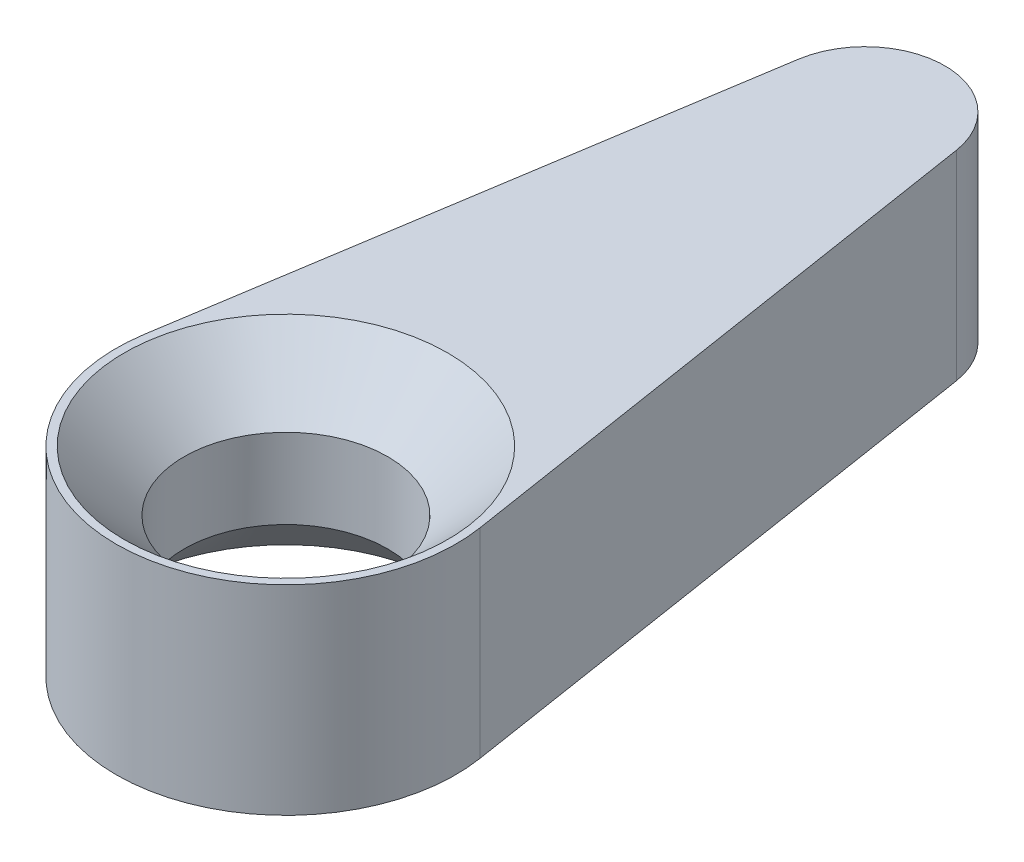
ISO-10303-21;
HEADER;
FILE_DESCRIPTION(('STEP AP214'),'2;1');
FILE_NAME('part.step','',(''),(''),'','','');
FILE_SCHEMA(('AUTOMOTIVE_DESIGN { 1 0 10303 214 1 1 1 1 }'));
ENDSEC;
DATA;
#1=APPLICATION_CONTEXT('core data for automotive mechanical design processes');
#2=APPLICATION_PROTOCOL_DEFINITION('international standard','automotive_design',2000,#1);
#3=PRODUCT_CONTEXT('',#1,'mechanical');
#4=PRODUCT('Part','Part','',(#3));
#5=PRODUCT_RELATED_PRODUCT_CATEGORY('part','',(#4));
#6=PRODUCT_DEFINITION_FORMATION('','',#4);
#7=PRODUCT_DEFINITION_CONTEXT('part definition',#1,'design');
#8=PRODUCT_DEFINITION('design','',#6,#7);
#9=PRODUCT_DEFINITION_SHAPE('','',#8);
#10=(LENGTH_UNIT() NAMED_UNIT(*) SI_UNIT(.MILLI.,.METRE.));
#11=(NAMED_UNIT(*) PLANE_ANGLE_UNIT() SI_UNIT($,.RADIAN.));
#12=(NAMED_UNIT(*) SI_UNIT($,.STERADIAN.) SOLID_ANGLE_UNIT());
#13=UNCERTAINTY_MEASURE_WITH_UNIT(LENGTH_MEASURE(1.E-05),#10,'distance_accuracy_value','');
#14=(GEOMETRIC_REPRESENTATION_CONTEXT(3) GLOBAL_UNCERTAINTY_ASSIGNED_CONTEXT((#13)) GLOBAL_UNIT_ASSIGNED_CONTEXT((#10,
#11,#12)) REPRESENTATION_CONTEXT('',''));
#15=CARTESIAN_POINT('',(0.,0.,0.));
#16=DIRECTION('',(0.,0.,1.));
#17=DIRECTION('',(1.,0.,0.));
#18=AXIS2_PLACEMENT_3D('',#15,#16,#17);
#19=CARTESIAN_POINT('',(0.,12.7,-36.83));
#20=DIRECTION('',(0.,-1.,0.));
#21=DIRECTION('',(0.,0.,-1.));
#22=AXIS2_PLACEMENT_3D('',#19,#20,#21);
#23=CYLINDRICAL_SURFACE('',#22,5.08);
#24=CARTESIAN_POINT('',(0.,0.,-36.83));
#25=DIRECTION('',(0.,1.,0.));
#26=DIRECTION('',(0.,0.,1.));
#27=AXIS2_PLACEMENT_3D('',#24,#25,#26);
#28=CIRCLE('',#27,5.08);
#29=CARTESIAN_POINT('',(-5.01846800978939,0.,-37.618275862069));
#30=VERTEX_POINT('',#29);
#31=CARTESIAN_POINT('',(5.01846800978939,0.,-37.618275862069));
#32=VERTEX_POINT('',#31);
#33=EDGE_CURVE('E125',#30,#32,#28,.F.);
#34=ORIENTED_EDGE('',*,*,#33,.F.);
#35=DIRECTION('',(0.,-1.,0.));
#36=VECTOR('',#35,1.);
#37=CARTESIAN_POINT('',(-5.01846800978939,12.7,-37.618275862069));
#38=LINE('',#37,#36);
#39=CARTESIAN_POINT('',(-5.01846800978939,12.7,-37.618275862069));
#40=VERTEX_POINT('',#39);
#41=EDGE_CURVE('E91',#40,#30,#38,.T.);
#42=ORIENTED_EDGE('',*,*,#41,.F.);
#43=CARTESIAN_POINT('',(0.,12.7,-36.83));
#44=DIRECTION('',(0.,1.,0.));
#45=DIRECTION('',(0.,0.,1.));
#46=AXIS2_PLACEMENT_3D('',#43,#44,#45);
#47=CIRCLE('',#46,5.08);
#48=CARTESIAN_POINT('',(5.01846800978939,12.7,-37.618275862069));
#49=VERTEX_POINT('',#48);
#50=EDGE_CURVE('E116',#40,#49,#47,.F.);
#51=ORIENTED_EDGE('',*,*,#50,.T.);
#52=DIRECTION('',(0.,-1.,0.));
#53=VECTOR('',#52,1.);
#54=CARTESIAN_POINT('',(5.01846800978939,12.7,-37.618275862069));
#55=LINE('',#54,#53);
#56=EDGE_CURVE('E68',#49,#32,#55,.T.);
#57=ORIENTED_EDGE('',*,*,#56,.T.);
#58=EDGE_LOOP('',(#34,#42,#51,#57));
#59=FACE_BOUND('',#58,.T.);
#60=ADVANCED_FACE('F49',(#59),#23,.T.);
#61=CARTESIAN_POINT('',(-10.6642445208024,12.7,-1.67508620689655));
#62=DIRECTION('',(-0.987887403501847,0.,-0.155172413793104));
#63=DIRECTION('',(-0.155172413793104,0.,0.987887403501847));
#64=AXIS2_PLACEMENT_3D('',#61,#62,#63);
#65=PLANE('',#64);
#66=DIRECTION('',(0.155172413793104,0.,-0.987887403501847));
#67=VECTOR('',#66,1.);
#68=CARTESIAN_POINT('',(-10.6642445208024,0.,-1.67508620689655));
#69=LINE('',#68,#67);
#70=CARTESIAN_POINT('',(-10.6642445208024,0.,-1.67508620689655));
#71=VERTEX_POINT('',#70);
#72=EDGE_CURVE('E103',#71,#30,#69,.T.);
#73=ORIENTED_EDGE('',*,*,#72,.F.);
#74=DIRECTION('',(0.,-1.,0.));
#75=VECTOR('',#74,1.);
#76=CARTESIAN_POINT('',(-10.6642445208024,12.7,-1.67508620689655));
#77=LINE('',#76,#75);
#78=CARTESIAN_POINT('',(-10.6642445208024,12.7,-1.67508620689655));
#79=VERTEX_POINT('',#78);
#80=EDGE_CURVE('E97',#79,#71,#77,.T.);
#81=ORIENTED_EDGE('',*,*,#80,.F.);
#82=DIRECTION('',(0.155172413793104,0.,-0.987887403501847));
#83=VECTOR('',#82,1.);
#84=CARTESIAN_POINT('',(-10.6642445208024,12.7,-1.67508620689655));
#85=LINE('',#84,#83);
#86=EDGE_CURVE('E101',#79,#40,#85,.T.);
#87=ORIENTED_EDGE('',*,*,#86,.T.);
#88=ORIENTED_EDGE('',*,*,#41,.T.);
#89=EDGE_LOOP('',(#73,#81,#87,#88));
#90=FACE_BOUND('',#89,.T.);
#91=ADVANCED_FACE('F99',(#90),#65,.T.);
#92=CARTESIAN_POINT('',(0.,12.7,0.));
#93=DIRECTION('',(0.,-1.,0.));
#94=DIRECTION('',(0.,0.,-1.));
#95=AXIS2_PLACEMENT_3D('',#92,#93,#94);
#96=CYLINDRICAL_SURFACE('',#95,10.795);
#97=CARTESIAN_POINT('',(0.,0.,0.));
#98=DIRECTION('',(0.,1.,0.));
#99=DIRECTION('',(0.,0.,1.));
#100=AXIS2_PLACEMENT_3D('',#97,#98,#99);
#101=CIRCLE('',#100,10.795);
#102=CARTESIAN_POINT('',(10.6642445208024,0.,-1.67508620689655));
#103=VERTEX_POINT('',#102);
#104=EDGE_CURVE('E130',#71,#103,#101,.T.);
#105=ORIENTED_EDGE('',*,*,#104,.T.);
#106=DIRECTION('',(0.,-1.,0.));
#107=VECTOR('',#106,1.);
#108=CARTESIAN_POINT('',(10.6642445208024,12.7,-1.67508620689655));
#109=LINE('',#108,#107);
#110=CARTESIAN_POINT('',(10.6642445208024,12.7,-1.67508620689655));
#111=VERTEX_POINT('',#110);
#112=EDGE_CURVE('E83',#111,#103,#109,.T.);
#113=ORIENTED_EDGE('',*,*,#112,.F.);
#114=CARTESIAN_POINT('',(0.,12.7,0.));
#115=DIRECTION('',(0.,1.,0.));
#116=DIRECTION('',(0.,0.,1.));
#117=AXIS2_PLACEMENT_3D('',#114,#115,#116);
#118=CIRCLE('',#117,10.795);
#119=EDGE_CURVE('E108',#79,#111,#118,.T.);
#120=ORIENTED_EDGE('',*,*,#119,.F.);
#121=ORIENTED_EDGE('',*,*,#80,.T.);
#122=EDGE_LOOP('',(#105,#113,#120,#121));
#123=FACE_BOUND('',#122,.T.);
#124=ADVANCED_FACE('F109',(#123),#96,.T.);
#125=CARTESIAN_POINT('',(10.6642445208024,12.7,-1.67508620689655));
#126=DIRECTION('',(0.987887403501847,0.,-0.155172413793104));
#127=DIRECTION('',(-0.155172413793104,0.,-0.987887403501847));
#128=AXIS2_PLACEMENT_3D('',#125,#126,#127);
#129=PLANE('',#128);
#130=DIRECTION('',(0.155172413793104,0.,0.987887403501847));
#131=VECTOR('',#130,1.);
#132=CARTESIAN_POINT('',(10.6642445208024,0.,-1.67508620689655));
#133=LINE('',#132,#131);
#134=EDGE_CURVE('E120',#32,#103,#133,.T.);
#135=ORIENTED_EDGE('',*,*,#134,.F.);
#136=ORIENTED_EDGE('',*,*,#56,.F.);
#137=DIRECTION('',(0.155172413793104,0.,0.987887403501847));
#138=VECTOR('',#137,1.);
#139=CARTESIAN_POINT('',(10.6642445208024,12.7,-1.67508620689655));
#140=LINE('',#139,#138);
#141=EDGE_CURVE('E113',#49,#111,#140,.T.);
#142=ORIENTED_EDGE('',*,*,#141,.T.);
#143=ORIENTED_EDGE('',*,*,#112,.T.);
#144=EDGE_LOOP('',(#135,#136,#142,#143));
#145=FACE_BOUND('',#144,.T.);
#146=ADVANCED_FACE('F165',(#145),#129,.T.);
#147=CARTESIAN_POINT('',(0.,12.7,0.));
#148=DIRECTION('',(0.,-1.,0.));
#149=DIRECTION('',(0.,0.,-1.));
#150=AXIS2_PLACEMENT_3D('',#147,#148,#149);
#151=CYLINDRICAL_SURFACE('',#150,6.477);
#152=CARTESIAN_POINT('',(0.,3.81000000000001,0.));
#153=DIRECTION('',(0.,1.,0.));
#154=DIRECTION('',(0.,0.,1.));
#155=AXIS2_PLACEMENT_3D('',#152,#153,#154);
#156=CIRCLE('',#155,6.477);
#157=CARTESIAN_POINT('',(0.,3.81000000000001,-6.477));
#158=VERTEX_POINT('',#157);
#159=EDGE_CURVE('E60',#158,#158,#156,.F.);
#160=ORIENTED_EDGE('',*,*,#159,.T.);
#161=EDGE_LOOP('',(#160));
#162=FACE_BOUND('',#161,.T.);
#163=CARTESIAN_POINT('',(0.,8.89,0.));
#164=DIRECTION('',(0.,1.,0.));
#165=DIRECTION('',(0.,0.,1.));
#166=AXIS2_PLACEMENT_3D('',#163,#164,#165);
#167=CIRCLE('',#166,6.477);
#168=CARTESIAN_POINT('',(0.,8.89,6.477));
#169=VERTEX_POINT('',#168);
#170=EDGE_CURVE('E146',#169,#169,#167,.T.);
#171=ORIENTED_EDGE('',*,*,#170,.T.);
#172=EDGE_LOOP('',(#171));
#173=FACE_BOUND('',#172,.T.);
#174=ADVANCED_FACE('F153',(#162,#173),#151,.F.);
#175=CARTESIAN_POINT('',(0.,12.7,0.));
#176=DIRECTION('',(0.,1.,0.));
#177=DIRECTION('',(0.,0.,1.));
#178=AXIS2_PLACEMENT_3D('',#175,#176,#177);
#179=PLANE('',#178);
#180=CARTESIAN_POINT('',(0.,12.7,0.));
#181=DIRECTION('',(0.,1.,0.));
#182=DIRECTION('',(0.,0.,1.));
#183=AXIS2_PLACEMENT_3D('',#180,#181,#182);
#184=CIRCLE('',#183,10.287);
#185=CARTESIAN_POINT('',(0.,12.7,10.287));
#186=VERTEX_POINT('',#185);
#187=EDGE_CURVE('E11',#186,#186,#184,.F.);
#188=ORIENTED_EDGE('',*,*,#187,.T.);
#189=EDGE_LOOP('',(#188));
#190=FACE_BOUND('',#189,.T.);
#191=ORIENTED_EDGE('',*,*,#50,.F.);
#192=ORIENTED_EDGE('',*,*,#86,.F.);
#193=ORIENTED_EDGE('',*,*,#119,.T.);
#194=ORIENTED_EDGE('',*,*,#141,.F.);
#195=EDGE_LOOP('',(#191,#192,#193,#194));
#196=FACE_BOUND('',#195,.T.);
#197=ADVANCED_FACE('F115',(#190,#196),#179,.T.);
#198=CARTESIAN_POINT('',(0.,0.,0.));
#199=DIRECTION('',(0.,1.,0.));
#200=DIRECTION('',(0.,0.,1.));
#201=AXIS2_PLACEMENT_3D('',#198,#199,#200);
#202=PLANE('',#201);
#203=CARTESIAN_POINT('',(0.,0.,0.));
#204=DIRECTION('',(0.,1.,0.));
#205=DIRECTION('',(0.,0.,1.));
#206=AXIS2_PLACEMENT_3D('',#203,#204,#205);
#207=CIRCLE('',#206,10.287);
#208=CARTESIAN_POINT('',(0.,0.,-10.287));
#209=VERTEX_POINT('',#208);
#210=EDGE_CURVE('E142',#209,#209,#207,.T.);
#211=ORIENTED_EDGE('',*,*,#210,.T.);
#212=EDGE_LOOP('',(#211));
#213=FACE_BOUND('',#212,.T.);
#214=ORIENTED_EDGE('',*,*,#33,.T.);
#215=ORIENTED_EDGE('',*,*,#134,.T.);
#216=ORIENTED_EDGE('',*,*,#104,.F.);
#217=ORIENTED_EDGE('',*,*,#72,.T.);
#218=EDGE_LOOP('',(#214,#215,#216,#217));
#219=FACE_BOUND('',#218,.T.);
#220=ADVANCED_FACE('F159',(#213,#219),#202,.F.);
#221=CARTESIAN_POINT('',(0.,0.,0.));
#222=DIRECTION('',(0.,-1.,0.));
#223=DIRECTION('',(0.,0.,-1.));
#224=AXIS2_PLACEMENT_3D('',#221,#222,#223);
#225=CONICAL_SURFACE('',#224,10.287,0.785398163397446);
#226=CARTESIAN_POINT('',(0.,3.81000000000001,-6.477));
#227=CARTESIAN_POINT('',(0.,3.77031250000001,-6.5166875));
#228=CARTESIAN_POINT('',(0.,3.73062500000001,-6.556375));
#229=CARTESIAN_POINT('',(0.,3.65125000000001,-6.63575));
#230=CARTESIAN_POINT('',(0.,3.61156250000001,-6.6754375));
#231=CARTESIAN_POINT('',(0.,3.53218750000001,-6.7548125));
#232=CARTESIAN_POINT('',(0.,3.49250000000001,-6.7945));
#233=CARTESIAN_POINT('',(0.,3.41312500000001,-6.873875));
#234=CARTESIAN_POINT('',(0.,3.37343750000001,-6.9135625));
#235=CARTESIAN_POINT('',(0.,3.29406250000001,-6.9929375));
#236=CARTESIAN_POINT('',(0.,3.25437500000001,-7.032625));
#237=CARTESIAN_POINT('',(0.,3.17500000000001,-7.112));
#238=CARTESIAN_POINT('',(0.,3.13531250000001,-7.1516875));
#239=CARTESIAN_POINT('',(0.,3.05593750000001,-7.2310625));
#240=CARTESIAN_POINT('',(0.,3.01625000000001,-7.27075));
#241=CARTESIAN_POINT('',(0.,2.93687500000001,-7.350125));
#242=CARTESIAN_POINT('',(0.,2.89718750000001,-7.3898125));
#243=CARTESIAN_POINT('',(0.,2.81781250000001,-7.4691875));
#244=CARTESIAN_POINT('',(0.,2.77812500000001,-7.508875));
#245=CARTESIAN_POINT('',(0.,2.69875000000001,-7.58825));
#246=CARTESIAN_POINT('',(0.,2.65906250000001,-7.6279375));
#247=CARTESIAN_POINT('',(0.,2.57968750000001,-7.7073125));
#248=CARTESIAN_POINT('',(0.,2.54000000000001,-7.747));
#249=CARTESIAN_POINT('',(0.,2.46062500000001,-7.826375));
#250=CARTESIAN_POINT('',(0.,2.42093750000001,-7.8660625));
#251=CARTESIAN_POINT('',(0.,2.34156250000001,-7.9454375));
#252=CARTESIAN_POINT('',(0.,2.301875,-7.985125));
#253=CARTESIAN_POINT('',(0.,2.22250000000001,-8.0645));
#254=CARTESIAN_POINT('',(0.,2.18281250000001,-8.1041875));
#255=CARTESIAN_POINT('',(0.,2.1034375,-8.1835625));
#256=CARTESIAN_POINT('',(0.,2.06375,-8.22325));
#257=CARTESIAN_POINT('',(0.,1.984375,-8.302625));
#258=CARTESIAN_POINT('',(0.,1.9446875,-8.34231249999999));
#259=CARTESIAN_POINT('',(0.,1.8653125,-8.4216875));
#260=CARTESIAN_POINT('',(0.,1.825625,-8.46137499999999));
#261=CARTESIAN_POINT('',(0.,1.74625,-8.54074999999999));
#262=CARTESIAN_POINT('',(0.,1.7065625,-8.5804375));
#263=CARTESIAN_POINT('',(0.,1.6271875,-8.65981249999999));
#264=CARTESIAN_POINT('',(0.,1.5875,-8.6995));
#265=CARTESIAN_POINT('',(0.,1.508125,-8.778875));
#266=CARTESIAN_POINT('',(0.,1.4684375,-8.8185625));
#267=CARTESIAN_POINT('',(0.,1.3890625,-8.89793749999999));
#268=CARTESIAN_POINT('',(0.,1.349375,-8.93762499999999));
#269=CARTESIAN_POINT('',(0.,1.27,-9.01699999999999));
#270=CARTESIAN_POINT('',(0.,1.2303125,-9.05668749999999));
#271=CARTESIAN_POINT('',(0.,1.1509375,-9.13606249999999));
#272=CARTESIAN_POINT('',(0.,1.11125,-9.17574999999999));
#273=CARTESIAN_POINT('',(0.,1.031875,-9.25512499999999));
#274=CARTESIAN_POINT('',(0.,0.992187500000002,-9.29481249999999));
#275=CARTESIAN_POINT('',(0.,0.912812500000002,-9.37418749999999));
#276=CARTESIAN_POINT('',(0.,0.873125000000002,-9.41387499999999));
#277=CARTESIAN_POINT('',(0.,0.793750000000002,-9.49324999999999));
#278=CARTESIAN_POINT('',(0.,0.754062500000002,-9.53293749999999));
#279=CARTESIAN_POINT('',(0.,0.674687500000002,-9.61231249999999));
#280=CARTESIAN_POINT('',(0.,0.635000000000002,-9.65199999999999));
#281=CARTESIAN_POINT('',(0.,0.555625000000001,-9.73137499999999));
#282=CARTESIAN_POINT('',(0.,0.515937500000001,-9.77106249999999));
#283=CARTESIAN_POINT('',(0.,0.436562500000001,-9.85043749999999));
#284=CARTESIAN_POINT('',(0.,0.396875000000001,-9.89012499999999));
#285=CARTESIAN_POINT('',(0.,0.317500000000001,-9.96949999999999));
#286=CARTESIAN_POINT('',(0.,0.277812500000001,-10.0091875));
#287=CARTESIAN_POINT('',(0.,0.1984375,-10.0885625));
#288=CARTESIAN_POINT('',(0.,0.15875,-10.12825));
#289=CARTESIAN_POINT('',(0.,0.0793750000000002,-10.207625));
#290=CARTESIAN_POINT('',(0.,0.0396875000000002,-10.2473125));
#291=CARTESIAN_POINT('',(0.,0.,-10.287));
#292=B_SPLINE_CURVE_WITH_KNOTS('',3,(#226,#227,#228,#229,#230,#231,#232,#233,#234,#235,#236,
#237,#238,#239,#240,#241,#242,#243,#244,#245,#246,#247,#248,#249,#250,#251,#252,#253,#254,#255,
#256,#257,#258,#259,#260,#261,#262,#263,#264,#265,#266,#267,#268,#269,#270,#271,#272,#273,#274,
#275,#276,#277,#278,#279,#280,#281,#282,#283,#284,#285,#286,#287,#288,#289,#290,#291),
.UNSPECIFIED.,.F.,.F.,(4,2,2,2,2,2,2,2,2,2,2,2,2,2,2,2,2,2,2,2,2,2,2,2,2,2,2,2,2,2,2,2,4),(0.,
0.168379802270046,0.336759604540093,0.50513940681014,0.673519209080186,0.841899011350233,
1.01027881362028,1.17865861589033,1.34703841816037,1.51541822043042,1.68379802270047,
1.85217782497051,2.02055762724056,2.18893742951061,2.35731723178065,2.5256970340507,
2.69407683632075,2.86245663859079,3.03083644086084,3.19921624313089,3.36759604540093,
3.53597584767098,3.70435564994103,3.87273545221107,4.04111525448112,4.20949505675117,
4.37787485902121,4.54625466129126,4.71463446356131,4.88301426583135,5.0513940681014,
5.21977387037145,5.38815367264149),.UNSPECIFIED.);
#293=EDGE_CURVE('BSEAM156',#158,#209,#292,.T.);
#294=ORIENTED_EDGE('',*,*,#159,.F.);
#295=ORIENTED_EDGE('',*,*,#210,.F.);
#296=ORIENTED_EDGE('',*,*,#293,.T.);
#297=ORIENTED_EDGE('',*,*,#293,.F.);
#298=EDGE_LOOP('',(#294,#296,#295,#297));
#299=FACE_BOUND('',#298,.T.);
#300=ADVANCED_FACE('F156',(#299),#225,.F.);
#301=CARTESIAN_POINT('',(0.,8.89,0.));
#302=DIRECTION('',(0.,1.,0.));
#303=DIRECTION('',(0.,0.,1.));
#304=AXIS2_PLACEMENT_3D('',#301,#302,#303);
#305=CONICAL_SURFACE('',#304,6.477,0.785398163397451);
#306=ORIENTED_EDGE('',*,*,#187,.F.);
#307=EDGE_LOOP('',(#306));
#308=FACE_BOUND('',#307,.T.);
#309=ORIENTED_EDGE('',*,*,#170,.F.);
#310=EDGE_LOOP('',(#309));
#311=FACE_BOUND('',#310,.T.);
#312=ADVANCED_FACE('F52',(#308,#311),#305,.F.);
#313=CLOSED_SHELL('',(#60,#91,#124,#146,#174,#197,#220,#300,#312));
#314=MANIFOLD_SOLID_BREP('B2',#313);
#315=ADVANCED_BREP_SHAPE_REPRESENTATION('',(#18,#314),#14);
#316=SHAPE_DEFINITION_REPRESENTATION(#9,#315);
ENDSEC;
END-ISO-10303-21;
